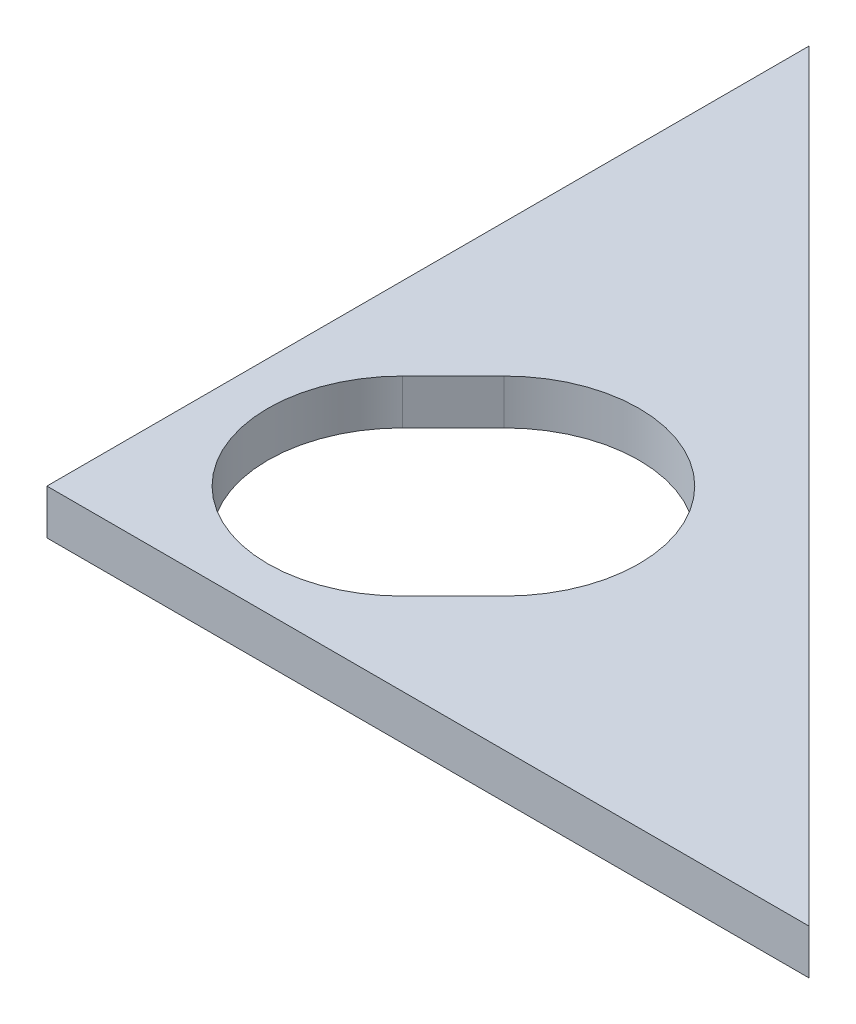
ISO-10303-21;
HEADER;
FILE_DESCRIPTION(('STEP AP214'),'2;1');
FILE_NAME('part.step','',(''),(''),'','','');
FILE_SCHEMA(('AUTOMOTIVE_DESIGN { 1 0 10303 214 1 1 1 1 }'));
ENDSEC;
DATA;
#1=APPLICATION_CONTEXT('core data for automotive mechanical design processes');
#2=APPLICATION_PROTOCOL_DEFINITION('international standard','automotive_design',2000,#1);
#3=PRODUCT_CONTEXT('',#1,'mechanical');
#4=PRODUCT('Part','Part','',(#3));
#5=PRODUCT_RELATED_PRODUCT_CATEGORY('part','',(#4));
#6=PRODUCT_DEFINITION_FORMATION('','',#4);
#7=PRODUCT_DEFINITION_CONTEXT('part definition',#1,'design');
#8=PRODUCT_DEFINITION('design','',#6,#7);
#9=PRODUCT_DEFINITION_SHAPE('','',#8);
#10=(LENGTH_UNIT() NAMED_UNIT(*) SI_UNIT(.MILLI.,.METRE.));
#11=(NAMED_UNIT(*) PLANE_ANGLE_UNIT() SI_UNIT($,.RADIAN.));
#12=(NAMED_UNIT(*) SI_UNIT($,.STERADIAN.) SOLID_ANGLE_UNIT());
#13=UNCERTAINTY_MEASURE_WITH_UNIT(LENGTH_MEASURE(1.E-05),#10,'distance_accuracy_value','');
#14=(GEOMETRIC_REPRESENTATION_CONTEXT(3) GLOBAL_UNCERTAINTY_ASSIGNED_CONTEXT((#13)) GLOBAL_UNIT_ASSIGNED_CONTEXT((#10,
#11,#12)) REPRESENTATION_CONTEXT('',''));
#15=CARTESIAN_POINT('',(0.,0.,0.));
#16=DIRECTION('',(0.,0.,1.));
#17=DIRECTION('',(1.,0.,0.));
#18=AXIS2_PLACEMENT_3D('',#15,#16,#17);
#19=CARTESIAN_POINT('',(32.3289220358489,3.175,-32.3289220358489));
#20=DIRECTION('',(0.,-1.,0.));
#21=DIRECTION('',(0.,0.,-1.));
#22=AXIS2_PLACEMENT_3D('',#19,#20,#21);
#23=CYLINDRICAL_SURFACE('',#22,19.05);
#24=CARTESIAN_POINT('',(32.3289220358489,3.175,-32.3289220358489));
#25=DIRECTION('',(0.,1.,0.));
#26=DIRECTION('',(1.,0.,0.));
#27=AXIS2_PLACEMENT_3D('',#24,#25,#26);
#28=CIRCLE('',#27,19.05);
#29=CARTESIAN_POINT('',(45.7993062174526,3.175,-18.8585378542452));
#30=VERTEX_POINT('',#29);
#31=CARTESIAN_POINT('',(18.8585378542452,3.175,-45.7993062174526));
#32=VERTEX_POINT('',#31);
#33=EDGE_CURVE('E10',#30,#32,#28,.T.);
#34=ORIENTED_EDGE('',*,*,#33,.T.);
#35=DIRECTION('',(0.,-1.,0.));
#36=VECTOR('',#35,1.);
#37=CARTESIAN_POINT('',(18.8585378542452,3.175,-45.7993062174526));
#38=LINE('',#37,#36);
#39=CARTESIAN_POINT('',(18.8585378542452,-3.175,-45.7993062174526));
#40=VERTEX_POINT('',#39);
#41=EDGE_CURVE('E26',#32,#40,#38,.T.);
#42=ORIENTED_EDGE('',*,*,#41,.T.);
#43=CARTESIAN_POINT('',(32.3289220358489,-3.175,-32.3289220358489));
#44=DIRECTION('',(0.,1.,0.));
#45=DIRECTION('',(1.,0.,0.));
#46=AXIS2_PLACEMENT_3D('',#43,#44,#45);
#47=CIRCLE('',#46,19.05);
#48=CARTESIAN_POINT('',(45.7993062174526,-3.175,-18.8585378542452));
#49=VERTEX_POINT('',#48);
#50=EDGE_CURVE('E84',#49,#40,#47,.T.);
#51=ORIENTED_EDGE('',*,*,#50,.F.);
#52=DIRECTION('',(0.,-1.,0.));
#53=VECTOR('',#52,1.);
#54=CARTESIAN_POINT('',(45.7993062174526,3.175,-18.8585378542452));
#55=LINE('',#54,#53);
#56=EDGE_CURVE('E81',#30,#49,#55,.T.);
#57=ORIENTED_EDGE('',*,*,#56,.F.);
#58=EDGE_LOOP('',(#34,#42,#51,#57));
#59=FACE_BOUND('',#58,.T.);
#60=ADVANCED_FACE('F16',(#59),#23,.F.);
#61=CARTESIAN_POINT('',(0.,3.175,0.));
#62=DIRECTION('',(0.,-1.,0.));
#63=DIRECTION('',(0.,0.,-1.));
#64=AXIS2_PLACEMENT_3D('',#61,#62,#63);
#65=PLANE('',#64);
#66=DIRECTION('',(1.,0.,0.));
#67=VECTOR('',#66,1.);
#68=CARTESIAN_POINT('',(0.,3.175,0.));
#69=LINE('',#68,#67);
#70=CARTESIAN_POINT('',(0.,3.175,0.));
#71=VERTEX_POINT('',#70);
#72=CARTESIAN_POINT('',(107.76307599829,3.175,0.));
#73=VERTEX_POINT('',#72);
#74=EDGE_CURVE('E128',#71,#73,#69,.T.);
#75=ORIENTED_EDGE('',*,*,#74,.T.);
#76=DIRECTION('',(-0.707106797889043,0.,-0.707106764484052));
#77=VECTOR('',#76,1.);
#78=CARTESIAN_POINT('',(107.76307599829,3.175,0.));
#79=LINE('',#78,#77);
#80=CARTESIAN_POINT('',(0.,3.175,-107.76307090737));
#81=VERTEX_POINT('',#80);
#82=EDGE_CURVE('E131',#73,#81,#79,.T.);
#83=ORIENTED_EDGE('',*,*,#82,.T.);
#84=DIRECTION('',(0.,0.,1.));
#85=VECTOR('',#84,1.);
#86=CARTESIAN_POINT('',(0.,3.175,-107.76307090737));
#87=LINE('',#86,#85);
#88=EDGE_CURVE('E111',#81,#71,#87,.T.);
#89=ORIENTED_EDGE('',*,*,#88,.T.);
#90=EDGE_LOOP('',(#75,#83,#89));
#91=FACE_BOUND('',#90,.T.);
#92=CARTESIAN_POINT('',(25.1447171389936,3.175,-25.1447171389936));
#93=DIRECTION('',(0.,1.,0.));
#94=DIRECTION('',(1.,0.,0.));
#95=AXIS2_PLACEMENT_3D('',#92,#93,#94);
#96=CIRCLE('',#95,19.05);
#97=CARTESIAN_POINT('',(11.6743329573899,3.175,-38.6151013205973));
#98=VERTEX_POINT('',#97);
#99=CARTESIAN_POINT('',(38.6151013205973,3.175,-11.6743329573899));
#100=VERTEX_POINT('',#99);
#101=EDGE_CURVE('E92',#98,#100,#96,.T.);
#102=ORIENTED_EDGE('',*,*,#101,.F.);
#103=DIRECTION('',(-0.707106781186548,0.,0.707106781186547));
#104=VECTOR('',#103,1.);
#105=CARTESIAN_POINT('',(18.8585378542452,3.175,-45.7993062174526));
#106=LINE('',#105,#104);
#107=EDGE_CURVE('E97',#32,#98,#106,.T.);
#108=ORIENTED_EDGE('',*,*,#107,.F.);
#109=ORIENTED_EDGE('',*,*,#33,.F.);
#110=DIRECTION('',(0.707106781186548,0.,-0.707106781186547));
#111=VECTOR('',#110,1.);
#112=CARTESIAN_POINT('',(38.6151013205973,3.175,-11.6743329573899));
#113=LINE('',#112,#111);
#114=EDGE_CURVE('E93',#100,#30,#113,.T.);
#115=ORIENTED_EDGE('',*,*,#114,.F.);
#116=EDGE_LOOP('',(#102,#108,#109,#115));
#117=FACE_BOUND('',#116,.T.);
#118=ADVANCED_FACE('F123',(#91,#117),#65,.F.);
#119=CARTESIAN_POINT('',(0.,-3.175,0.));
#120=DIRECTION('',(0.,-1.,0.));
#121=DIRECTION('',(0.,0.,-1.));
#122=AXIS2_PLACEMENT_3D('',#119,#120,#121);
#123=PLANE('',#122);
#124=DIRECTION('',(1.,0.,0.));
#125=VECTOR('',#124,1.);
#126=CARTESIAN_POINT('',(0.,-3.175,0.));
#127=LINE('',#126,#125);
#128=CARTESIAN_POINT('',(0.,-3.175,0.));
#129=VERTEX_POINT('',#128);
#130=CARTESIAN_POINT('',(107.76307599829,-3.175,0.));
#131=VERTEX_POINT('',#130);
#132=EDGE_CURVE('E101',#129,#131,#127,.T.);
#133=ORIENTED_EDGE('',*,*,#132,.F.);
#134=DIRECTION('',(0.,0.,1.));
#135=VECTOR('',#134,1.);
#136=CARTESIAN_POINT('',(0.,-3.175,-107.76307090737));
#137=LINE('',#136,#135);
#138=CARTESIAN_POINT('',(0.,-3.175,-107.76307090737));
#139=VERTEX_POINT('',#138);
#140=EDGE_CURVE('E105',#139,#129,#137,.T.);
#141=ORIENTED_EDGE('',*,*,#140,.F.);
#142=DIRECTION('',(-0.707106797889043,0.,-0.707106764484052));
#143=VECTOR('',#142,1.);
#144=CARTESIAN_POINT('',(107.76307599829,-3.175,0.));
#145=LINE('',#144,#143);
#146=EDGE_CURVE('E108',#131,#139,#145,.T.);
#147=ORIENTED_EDGE('',*,*,#146,.F.);
#148=EDGE_LOOP('',(#133,#141,#147));
#149=FACE_BOUND('',#148,.T.);
#150=DIRECTION('',(-0.707106781186548,0.,0.707106781186547));
#151=VECTOR('',#150,1.);
#152=CARTESIAN_POINT('',(18.8585378542452,-3.175,-45.7993062174527));
#153=LINE('',#152,#151);
#154=CARTESIAN_POINT('',(11.6743329573899,-3.175,-38.6151013205973));
#155=VERTEX_POINT('',#154);
#156=EDGE_CURVE('E87',#40,#155,#153,.T.);
#157=ORIENTED_EDGE('',*,*,#156,.T.);
#158=CARTESIAN_POINT('',(25.1447171389936,-3.175,-25.1447171389936));
#159=DIRECTION('',(0.,1.,0.));
#160=DIRECTION('',(1.,0.,0.));
#161=AXIS2_PLACEMENT_3D('',#158,#159,#160);
#162=CIRCLE('',#161,19.05);
#163=CARTESIAN_POINT('',(38.6151013205973,-3.175,-11.6743329573899));
#164=VERTEX_POINT('',#163);
#165=EDGE_CURVE('E71',#155,#164,#162,.T.);
#166=ORIENTED_EDGE('',*,*,#165,.T.);
#167=DIRECTION('',(0.707106781186548,0.,-0.707106781186547));
#168=VECTOR('',#167,1.);
#169=CARTESIAN_POINT('',(38.6151013205973,-3.175,-11.6743329573899));
#170=LINE('',#169,#168);
#171=EDGE_CURVE('E77',#164,#49,#170,.T.);
#172=ORIENTED_EDGE('',*,*,#171,.T.);
#173=ORIENTED_EDGE('',*,*,#50,.T.);
#174=EDGE_LOOP('',(#157,#166,#172,#173));
#175=FACE_BOUND('',#174,.T.);
#176=ADVANCED_FACE('F86',(#149,#175),#123,.T.);
#177=CARTESIAN_POINT('',(107.76307599829,3.175,0.));
#178=DIRECTION('',(0.,0.,-1.));
#179=DIRECTION('',(-1.,0.,0.));
#180=AXIS2_PLACEMENT_3D('',#177,#178,#179);
#181=PLANE('',#180);
#182=ORIENTED_EDGE('',*,*,#132,.T.);
#183=DIRECTION('',(0.,-1.,0.));
#184=VECTOR('',#183,1.);
#185=CARTESIAN_POINT('',(107.76307599829,3.175,0.));
#186=LINE('',#185,#184);
#187=EDGE_CURVE('E107',#73,#131,#186,.T.);
#188=ORIENTED_EDGE('',*,*,#187,.F.);
#189=ORIENTED_EDGE('',*,*,#74,.F.);
#190=DIRECTION('',(0.,-1.,0.));
#191=VECTOR('',#190,1.);
#192=CARTESIAN_POINT('',(0.,3.175,0.));
#193=LINE('',#192,#191);
#194=EDGE_CURVE('E104',#71,#129,#193,.T.);
#195=ORIENTED_EDGE('',*,*,#194,.T.);
#196=EDGE_LOOP('',(#182,#188,#189,#195));
#197=FACE_BOUND('',#196,.T.);
#198=ADVANCED_FACE('F141',(#197),#181,.F.);
#199=CARTESIAN_POINT('',(0.,3.175,-107.76307090737));
#200=DIRECTION('',(-0.707106764484052,0.,0.707106797889043));
#201=DIRECTION('',(0.707106797889043,0.,0.707106764484052));
#202=AXIS2_PLACEMENT_3D('',#199,#200,#201);
#203=PLANE('',#202);
#204=ORIENTED_EDGE('',*,*,#146,.T.);
#205=DIRECTION('',(0.,-1.,0.));
#206=VECTOR('',#205,1.);
#207=CARTESIAN_POINT('',(0.,3.175,-107.76307090737));
#208=LINE('',#207,#206);
#209=EDGE_CURVE('E94',#81,#139,#208,.T.);
#210=ORIENTED_EDGE('',*,*,#209,.F.);
#211=ORIENTED_EDGE('',*,*,#82,.F.);
#212=ORIENTED_EDGE('',*,*,#187,.T.);
#213=EDGE_LOOP('',(#204,#210,#211,#212));
#214=FACE_BOUND('',#213,.T.);
#215=ADVANCED_FACE('F146',(#214),#203,.F.);
#216=CARTESIAN_POINT('',(0.,3.175,0.));
#217=DIRECTION('',(1.,0.,0.));
#218=DIRECTION('',(0.,0.,-1.));
#219=AXIS2_PLACEMENT_3D('',#216,#217,#218);
#220=PLANE('',#219);
#221=ORIENTED_EDGE('',*,*,#140,.T.);
#222=ORIENTED_EDGE('',*,*,#194,.F.);
#223=ORIENTED_EDGE('',*,*,#88,.F.);
#224=ORIENTED_EDGE('',*,*,#209,.T.);
#225=EDGE_LOOP('',(#221,#222,#223,#224));
#226=FACE_BOUND('',#225,.T.);
#227=ADVANCED_FACE('F142',(#226),#220,.F.);
#228=CARTESIAN_POINT('',(25.1447171389936,3.175,-25.1447171389936));
#229=DIRECTION('',(0.,-1.,0.));
#230=DIRECTION('',(0.,0.,-1.));
#231=AXIS2_PLACEMENT_3D('',#228,#229,#230);
#232=CYLINDRICAL_SURFACE('',#231,19.05);
#233=ORIENTED_EDGE('',*,*,#165,.F.);
#234=DIRECTION('',(0.,-1.,0.));
#235=VECTOR('',#234,1.);
#236=CARTESIAN_POINT('',(11.6743329573899,3.175,-38.6151013205973));
#237=LINE('',#236,#235);
#238=EDGE_CURVE('E118',#98,#155,#237,.T.);
#239=ORIENTED_EDGE('',*,*,#238,.F.);
#240=ORIENTED_EDGE('',*,*,#101,.T.);
#241=DIRECTION('',(0.,-1.,0.));
#242=VECTOR('',#241,1.);
#243=CARTESIAN_POINT('',(38.6151013205973,3.175,-11.6743329573899));
#244=LINE('',#243,#242);
#245=EDGE_CURVE('E20',#100,#164,#244,.T.);
#246=ORIENTED_EDGE('',*,*,#245,.T.);
#247=EDGE_LOOP('',(#233,#239,#240,#246));
#248=FACE_BOUND('',#247,.T.);
#249=ADVANCED_FACE('F18',(#248),#232,.F.);
#250=CARTESIAN_POINT('',(38.6151013205973,3.175,-11.6743329573899));
#251=DIRECTION('',(-0.707106781186548,0.,-0.707106781186547));
#252=DIRECTION('',(-0.707106781186547,0.,0.707106781186548));
#253=AXIS2_PLACEMENT_3D('',#250,#251,#252);
#254=PLANE('',#253);
#255=ORIENTED_EDGE('',*,*,#171,.F.);
#256=ORIENTED_EDGE('',*,*,#245,.F.);
#257=ORIENTED_EDGE('',*,*,#114,.T.);
#258=ORIENTED_EDGE('',*,*,#56,.T.);
#259=EDGE_LOOP('',(#255,#256,#257,#258));
#260=FACE_BOUND('',#259,.T.);
#261=ADVANCED_FACE('F78',(#260),#254,.T.);
#262=CARTESIAN_POINT('',(11.6743329573899,3.175,-38.6151013205973));
#263=DIRECTION('',(0.707106781186547,0.,0.707106781186548));
#264=DIRECTION('',(0.707106781186548,0.,-0.707106781186547));
#265=AXIS2_PLACEMENT_3D('',#262,#263,#264);
#266=PLANE('',#265);
#267=ORIENTED_EDGE('',*,*,#156,.F.);
#268=ORIENTED_EDGE('',*,*,#41,.F.);
#269=ORIENTED_EDGE('',*,*,#107,.T.);
#270=ORIENTED_EDGE('',*,*,#238,.T.);
#271=EDGE_LOOP('',(#267,#268,#269,#270));
#272=FACE_BOUND('',#271,.T.);
#273=ADVANCED_FACE('F120',(#272),#266,.T.);
#274=CLOSED_SHELL('',(#60,#118,#176,#198,#215,#227,#249,#261,#273));
#275=MANIFOLD_SOLID_BREP('B1',#274);
#276=ADVANCED_BREP_SHAPE_REPRESENTATION('',(#18,#275),#14);
#277=SHAPE_DEFINITION_REPRESENTATION(#9,#276);
ENDSEC;
END-ISO-10303-21;
